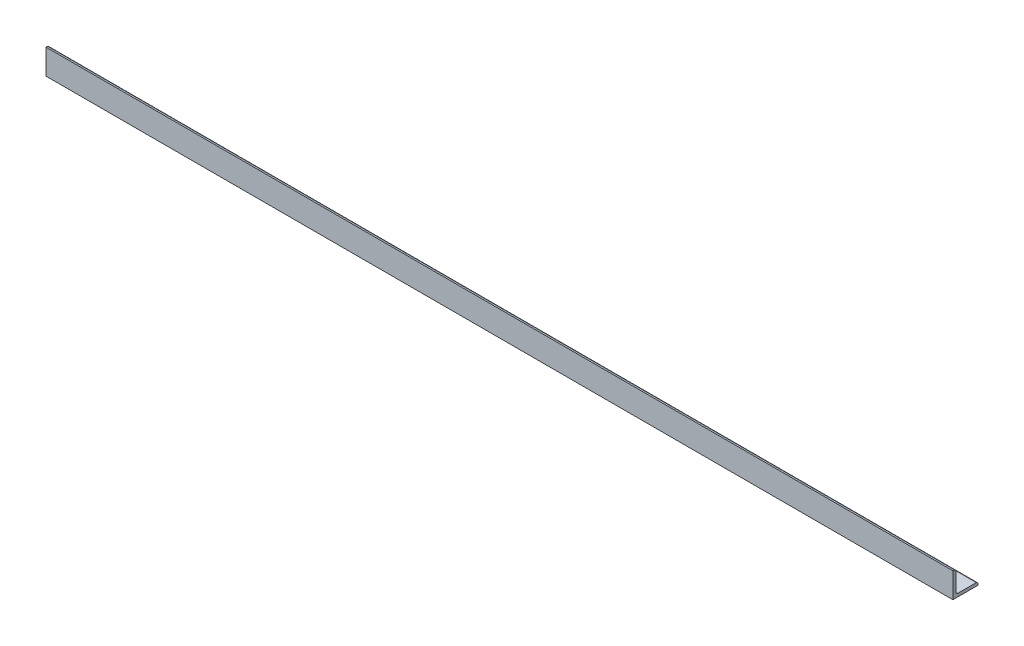
ISO-10303-21;
HEADER;
FILE_DESCRIPTION(('STEP AP214'),'2;1');
FILE_NAME('part.step','',(''),(''),'','','');
FILE_SCHEMA(('AUTOMOTIVE_DESIGN { 1 0 10303 214 1 1 1 1 }'));
ENDSEC;
DATA;
#1=APPLICATION_CONTEXT('core data for automotive mechanical design processes');
#2=APPLICATION_PROTOCOL_DEFINITION('international standard','automotive_design',2000,#1);
#3=PRODUCT_CONTEXT('',#1,'mechanical');
#4=PRODUCT('Part','Part','',(#3));
#5=PRODUCT_RELATED_PRODUCT_CATEGORY('part','',(#4));
#6=PRODUCT_DEFINITION_FORMATION('','',#4);
#7=PRODUCT_DEFINITION_CONTEXT('part definition',#1,'design');
#8=PRODUCT_DEFINITION('design','',#6,#7);
#9=PRODUCT_DEFINITION_SHAPE('','',#8);
#10=(LENGTH_UNIT() NAMED_UNIT(*) SI_UNIT(.MILLI.,.METRE.));
#11=(NAMED_UNIT(*) PLANE_ANGLE_UNIT() SI_UNIT($,.RADIAN.));
#12=(NAMED_UNIT(*) SI_UNIT($,.STERADIAN.) SOLID_ANGLE_UNIT());
#13=UNCERTAINTY_MEASURE_WITH_UNIT(LENGTH_MEASURE(1.E-05),#10,'distance_accuracy_value','');
#14=(GEOMETRIC_REPRESENTATION_CONTEXT(3) GLOBAL_UNCERTAINTY_ASSIGNED_CONTEXT((#13)) GLOBAL_UNIT_ASSIGNED_CONTEXT((#10,
#11,#12)) REPRESENTATION_CONTEXT('',''));
#15=CARTESIAN_POINT('',(0.,0.,0.));
#16=DIRECTION('',(0.,0.,1.));
#17=DIRECTION('',(1.,0.,0.));
#18=AXIS2_PLACEMENT_3D('',#15,#16,#17);
#19=CARTESIAN_POINT('',(150.460652388512,-310.689072168843,-670.15));
#20=DIRECTION('',(0.,-1.,0.));
#21=DIRECTION('',(0.,0.,-1.));
#22=AXIS2_PLACEMENT_3D('',#19,#20,#21);
#23=CYLINDRICAL_SURFACE('',#22,3.4);
#24=CARTESIAN_POINT('',(150.460652388512,-305.926572168843,-670.15));
#25=DIRECTION('',(0.,-1.,0.));
#26=DIRECTION('',(0.,0.,-1.));
#27=AXIS2_PLACEMENT_3D('',#24,#25,#26);
#28=CIRCLE('',#27,3.4);
#29=CARTESIAN_POINT('',(150.460652388512,-305.926572168843,-673.55));
#30=VERTEX_POINT('',#29);
#31=EDGE_CURVE('E19',#30,#30,#28,.F.);
#32=ORIENTED_EDGE('',*,*,#31,.T.);
#33=EDGE_LOOP('',(#32));
#34=FACE_BOUND('',#33,.T.);
#35=CARTESIAN_POINT('',(150.460652388512,-310.017902480979,-670.15));
#36=DIRECTION('',(0.,-1.,0.));
#37=DIRECTION('',(-1.,0.,0.));
#38=AXIS2_PLACEMENT_3D('',#35,#36,#37);
#39=CIRCLE('',#38,3.39999999999394);
#40=CARTESIAN_POINT('',(147.060652388518,-310.017902480979,-670.15));
#41=VERTEX_POINT('',#40);
#42=EDGE_CURVE('E102',#41,#41,#39,.T.);
#43=ORIENTED_EDGE('',*,*,#42,.T.);
#44=EDGE_LOOP('',(#43));
#45=FACE_BOUND('',#44,.T.);
#46=ADVANCED_FACE('F16',(#34,#45),#23,.F.);
#47=CARTESIAN_POINT('',(-150.489347611488,-310.689072168843,-670.15));
#48=DIRECTION('',(0.,-1.,0.));
#49=DIRECTION('',(0.,0.,-1.));
#50=AXIS2_PLACEMENT_3D('',#47,#48,#49);
#51=CYLINDRICAL_SURFACE('',#50,3.4);
#52=CARTESIAN_POINT('',(-150.489347611488,-305.926572168843,-670.15));
#53=DIRECTION('',(0.,-1.,0.));
#54=DIRECTION('',(0.,0.,-1.));
#55=AXIS2_PLACEMENT_3D('',#52,#53,#54);
#56=CIRCLE('',#55,3.4);
#57=CARTESIAN_POINT('',(-150.489347611488,-305.926572168843,-673.55));
#58=VERTEX_POINT('',#57);
#59=EDGE_CURVE('E163',#58,#58,#56,.F.);
#60=ORIENTED_EDGE('',*,*,#59,.T.);
#61=EDGE_LOOP('',(#60));
#62=FACE_BOUND('',#61,.T.);
#63=CARTESIAN_POINT('',(-150.489347611488,-310.017902480922,-670.15));
#64=DIRECTION('',(0.,-1.,0.));
#65=DIRECTION('',(-1.,0.,0.));
#66=AXIS2_PLACEMENT_3D('',#63,#64,#65);
#67=CIRCLE('',#66,3.39999999999421);
#68=CARTESIAN_POINT('',(-153.889347611482,-310.017902480922,-670.15));
#69=VERTEX_POINT('',#68);
#70=EDGE_CURVE('E196',#69,#69,#67,.T.);
#71=ORIENTED_EDGE('',*,*,#70,.T.);
#72=EDGE_LOOP('',(#71));
#73=FACE_BOUND('',#72,.T.);
#74=ADVANCED_FACE('F404',(#62,#73),#51,.F.);
#75=CARTESIAN_POINT('',(-150.489347611488,-310.689072168827,-670.15));
#76=DIRECTION('',(0.,-1.,0.));
#77=DIRECTION('',(0.,0.,-1.));
#78=AXIS2_PLACEMENT_3D('',#75,#76,#77);
#79=CONICAL_SURFACE('',#78,4.5624999999582,1.04719755120111);
#80=CARTESIAN_POINT('',(-150.489347611488,-310.689072168827,-670.15));
#81=DIRECTION('',(0.,-1.,0.));
#82=DIRECTION('',(0.,0.,-1.));
#83=AXIS2_PLACEMENT_3D('',#80,#81,#82);
#84=CIRCLE('',#83,4.56249999995817);
#85=CARTESIAN_POINT('',(-150.489347611488,-310.689072168827,-674.712499999958));
#86=VERTEX_POINT('',#85);
#87=EDGE_CURVE('E217',#86,#86,#84,.T.);
#88=ORIENTED_EDGE('',*,*,#87,.T.);
#89=EDGE_LOOP('',(#88));
#90=FACE_BOUND('',#89,.T.);
#91=ORIENTED_EDGE('',*,*,#70,.F.);
#92=EDGE_LOOP('',(#91));
#93=FACE_BOUND('',#92,.T.);
#94=ADVANCED_FACE('F394',(#90,#93),#79,.F.);
#95=CARTESIAN_POINT('',(-823.489347611489,-268.779069768843,-675.15));
#96=DIRECTION('',(0.,-1.,0.));
#97=DIRECTION('',(0.,0.,-1.));
#98=AXIS2_PLACEMENT_3D('',#95,#96,#97);
#99=CYLINDRICAL_SURFACE('',#98,4.5);
#100=CARTESIAN_POINT('',(-823.489347611489,-310.689072168843,-675.15));
#101=DIRECTION('',(0.,-1.,0.));
#102=DIRECTION('',(0.,0.,-1.));
#103=AXIS2_PLACEMENT_3D('',#100,#101,#102);
#104=CIRCLE('',#103,4.5);
#105=CARTESIAN_POINT('',(-823.489347611489,-310.689072168843,-679.65));
#106=VERTEX_POINT('',#105);
#107=EDGE_CURVE('E213',#106,#106,#104,.T.);
#108=ORIENTED_EDGE('',*,*,#107,.T.);
#109=EDGE_LOOP('',(#108));
#110=FACE_BOUND('',#109,.T.);
#111=CARTESIAN_POINT('',(-823.489347611489,-305.926572168843,-675.15));
#112=DIRECTION('',(0.,-1.,0.));
#113=DIRECTION('',(0.,0.,-1.));
#114=AXIS2_PLACEMENT_3D('',#111,#112,#113);
#115=CIRCLE('',#114,4.5);
#116=CARTESIAN_POINT('',(-823.489347611489,-305.926572168843,-679.65));
#117=VERTEX_POINT('',#116);
#118=EDGE_CURVE('E226',#117,#117,#115,.F.);
#119=ORIENTED_EDGE('',*,*,#118,.T.);
#120=EDGE_LOOP('',(#119));
#121=FACE_BOUND('',#120,.T.);
#122=ADVANCED_FACE('F384',(#110,#121),#99,.F.);
#123=CARTESIAN_POINT('',(150.460652388512,-310.689072168884,-670.15));
#124=DIRECTION('',(0.,-1.,0.));
#125=DIRECTION('',(0.,0.,-1.));
#126=AXIS2_PLACEMENT_3D('',#123,#124,#125);
#127=CONICAL_SURFACE('',#126,4.56249999995792,1.04719755120111);
#128=CARTESIAN_POINT('',(150.460652388512,-310.689072168884,-670.15));
#129=DIRECTION('',(0.,-1.,0.));
#130=DIRECTION('',(0.,0.,-1.));
#131=AXIS2_PLACEMENT_3D('',#128,#129,#130);
#132=CIRCLE('',#131,4.56249999995795);
#133=CARTESIAN_POINT('',(150.460652388512,-310.689072168884,-674.712499999958));
#134=VERTEX_POINT('',#133);
#135=EDGE_CURVE('E185',#134,#134,#132,.T.);
#136=ORIENTED_EDGE('',*,*,#135,.T.);
#137=EDGE_LOOP('',(#136));
#138=FACE_BOUND('',#137,.T.);
#139=ORIENTED_EDGE('',*,*,#42,.F.);
#140=EDGE_LOOP('',(#139));
#141=FACE_BOUND('',#140,.T.);
#142=ADVANCED_FACE('F375',(#138,#141),#127,.F.);
#143=CARTESIAN_POINT('',(551.510652388512,-305.926572168843,-690.15));
#144=DIRECTION('',(0.,0.,1.));
#145=DIRECTION('',(1.,0.,0.));
#146=AXIS2_PLACEMENT_3D('',#143,#144,#145);
#147=PLANE('',#146);
#148=DIRECTION('',(0.,1.,0.));
#149=VECTOR('',#148,1.);
#150=CARTESIAN_POINT('',(-861.589347611489,-310.689072168843,-690.15));
#151=LINE('',#150,#149);
#152=CARTESIAN_POINT('',(-861.589347611489,-308.926572168843,-690.15));
#153=VERTEX_POINT('',#152);
#154=CARTESIAN_POINT('',(-861.589347611489,-310.689072168843,-690.15));
#155=VERTEX_POINT('',#154);
#156=EDGE_CURVE('E172',#153,#155,#151,.F.);
#157=ORIENTED_EDGE('',*,*,#156,.F.);
#158=DIRECTION('',(-1.,0.,0.));
#159=VECTOR('',#158,1.);
#160=CARTESIAN_POINT('',(0.,-308.926572168843,-690.15));
#161=LINE('',#160,#159);
#162=CARTESIAN_POINT('',(514.610652388512,-308.926572168843,-690.15));
#163=VERTEX_POINT('',#162);
#164=EDGE_CURVE('E158',#163,#153,#161,.T.);
#165=ORIENTED_EDGE('',*,*,#164,.F.);
#166=DIRECTION('',(0.,1.,0.));
#167=VECTOR('',#166,1.);
#168=CARTESIAN_POINT('',(514.610652388512,-313.864072168843,-690.15));
#169=LINE('',#168,#167);
#170=CARTESIAN_POINT('',(514.610652388512,-310.689072168843,-690.15));
#171=VERTEX_POINT('',#170);
#172=EDGE_CURVE('E121',#171,#163,#169,.T.);
#173=ORIENTED_EDGE('',*,*,#172,.F.);
#174=DIRECTION('',(1.,0.,0.));
#175=VECTOR('',#174,1.);
#176=CARTESIAN_POINT('',(551.510652388512,-310.689072168843,-690.15));
#177=LINE('',#176,#175);
#178=EDGE_CURVE('E168',#171,#155,#177,.F.);
#179=ORIENTED_EDGE('',*,*,#178,.T.);
#180=EDGE_LOOP('',(#157,#165,#173,#179));
#181=FACE_BOUND('',#180,.T.);
#182=ADVANCED_FACE('F252',(#181),#147,.F.);
#183=CARTESIAN_POINT('',(551.510652388512,-272.589072168843,-656.8125));
#184=DIRECTION('',(0.,0.,1.));
#185=DIRECTION('',(1.,0.,0.));
#186=AXIS2_PLACEMENT_3D('',#183,#184,#185);
#187=PLANE('',#186);
#188=DIRECTION('',(0.,1.,0.));
#189=VECTOR('',#188,1.);
#190=CARTESIAN_POINT('',(514.610652388512,-313.864072168843,-656.8125));
#191=LINE('',#190,#189);
#192=CARTESIAN_POINT('',(514.610652388512,-302.926572168843,-656.8125));
#193=VERTEX_POINT('',#192);
#194=CARTESIAN_POINT('',(514.610652388512,-275.589072168843,-656.8125));
#195=VERTEX_POINT('',#194);
#196=EDGE_CURVE('E106',#193,#195,#191,.T.);
#197=ORIENTED_EDGE('',*,*,#196,.F.);
#198=DIRECTION('',(-1.,0.,0.));
#199=VECTOR('',#198,1.);
#200=CARTESIAN_POINT('',(0.,-302.926572168843,-656.8125));
#201=LINE('',#200,#199);
#202=CARTESIAN_POINT('',(-861.589347611489,-302.926572168843,-656.8125));
#203=VERTEX_POINT('',#202);
#204=EDGE_CURVE('E93',#193,#203,#201,.T.);
#205=ORIENTED_EDGE('',*,*,#204,.T.);
#206=DIRECTION('',(0.,1.,0.));
#207=VECTOR('',#206,1.);
#208=CARTESIAN_POINT('',(-861.589347611489,-310.689072168843,-656.8125));
#209=LINE('',#208,#207);
#210=CARTESIAN_POINT('',(-861.589347611489,-275.589072168843,-656.8125));
#211=VERTEX_POINT('',#210);
#212=EDGE_CURVE('E206',#211,#203,#209,.F.);
#213=ORIENTED_EDGE('',*,*,#212,.F.);
#214=DIRECTION('',(1.,0.,0.));
#215=VECTOR('',#214,1.);
#216=CARTESIAN_POINT('',(0.,-275.589072168843,-656.8125));
#217=LINE('',#216,#215);
#218=EDGE_CURVE('E113',#195,#211,#217,.F.);
#219=ORIENTED_EDGE('',*,*,#218,.F.);
#220=EDGE_LOOP('',(#197,#205,#213,#219));
#221=FACE_BOUND('',#220,.T.);
#222=ADVANCED_FACE('F112',(#221),#187,.F.);
#223=CARTESIAN_POINT('',(0.,-302.926572168843,-659.8125));
#224=DIRECTION('',(-1.,0.,0.));
#225=DIRECTION('',(0.,0.,1.));
#226=AXIS2_PLACEMENT_3D('',#223,#224,#225);
#227=CYLINDRICAL_SURFACE('',#226,3.);
#228=CARTESIAN_POINT('',(-861.589347611489,-302.926572168843,-659.8125));
#229=DIRECTION('',(-1.,0.,0.));
#230=DIRECTION('',(0.,0.,1.));
#231=AXIS2_PLACEMENT_3D('',#228,#229,#230);
#232=CIRCLE('',#231,3.);
#233=CARTESIAN_POINT('',(-861.589347611489,-305.926572168843,-659.8125));
#234=VERTEX_POINT('',#233);
#235=EDGE_CURVE('E97',#203,#234,#232,.F.);
#236=ORIENTED_EDGE('',*,*,#235,.F.);
#237=ORIENTED_EDGE('',*,*,#204,.F.);
#238=CARTESIAN_POINT('',(514.610652388512,-302.926572168843,-659.8125));
#239=DIRECTION('',(-1.,0.,0.));
#240=DIRECTION('',(0.,0.,1.));
#241=AXIS2_PLACEMENT_3D('',#238,#239,#240);
#242=CIRCLE('',#241,3.);
#243=CARTESIAN_POINT('',(514.610652388512,-305.926572168843,-659.8125));
#244=VERTEX_POINT('',#243);
#245=EDGE_CURVE('E96',#244,#193,#242,.T.);
#246=ORIENTED_EDGE('',*,*,#245,.F.);
#247=DIRECTION('',(1.,0.,0.));
#248=VECTOR('',#247,1.);
#249=CARTESIAN_POINT('',(551.510652388512,-305.926572168843,-659.8125));
#250=LINE('',#249,#248);
#251=EDGE_CURVE('E86',#244,#234,#250,.F.);
#252=ORIENTED_EDGE('',*,*,#251,.T.);
#253=EDGE_LOOP('',(#236,#237,#246,#252));
#254=FACE_BOUND('',#253,.T.);
#255=ADVANCED_FACE('F95',(#254),#227,.F.);
#256=CARTESIAN_POINT('',(551.510652388512,-305.926572168843,-656.8125));
#257=DIRECTION('',(0.,-1.,0.));
#258=DIRECTION('',(0.,0.,-1.));
#259=AXIS2_PLACEMENT_3D('',#256,#257,#258);
#260=PLANE('',#259);
#261=ORIENTED_EDGE('',*,*,#59,.F.);
#262=EDGE_LOOP('',(#261));
#263=FACE_BOUND('',#262,.T.);
#264=ORIENTED_EDGE('',*,*,#118,.F.);
#265=EDGE_LOOP('',(#264));
#266=FACE_BOUND('',#265,.T.);
#267=ORIENTED_EDGE('',*,*,#31,.F.);
#268=EDGE_LOOP('',(#267));
#269=FACE_BOUND('',#268,.T.);
#270=DIRECTION('',(0.,0.,-1.));
#271=VECTOR('',#270,1.);
#272=CARTESIAN_POINT('',(514.610652388512,-305.926572168843,-133.95));
#273=LINE('',#272,#271);
#274=CARTESIAN_POINT('',(514.610652388512,-305.926572168843,-687.15));
#275=VERTEX_POINT('',#274);
#276=EDGE_CURVE('E109',#275,#244,#273,.F.);
#277=ORIENTED_EDGE('',*,*,#276,.F.);
#278=DIRECTION('',(-1.,0.,0.));
#279=VECTOR('',#278,1.);
#280=CARTESIAN_POINT('',(0.,-305.926572168843,-687.15));
#281=LINE('',#280,#279);
#282=CARTESIAN_POINT('',(-861.589347611489,-305.926572168843,-687.15));
#283=VERTEX_POINT('',#282);
#284=EDGE_CURVE('E160',#283,#275,#281,.F.);
#285=ORIENTED_EDGE('',*,*,#284,.F.);
#286=DIRECTION('',(0.,0.,1.));
#287=VECTOR('',#286,1.);
#288=CARTESIAN_POINT('',(-861.589347611489,-305.926572168843,-793.95));
#289=LINE('',#288,#287);
#290=EDGE_CURVE('E203',#234,#283,#289,.F.);
#291=ORIENTED_EDGE('',*,*,#290,.F.);
#292=ORIENTED_EDGE('',*,*,#251,.F.);
#293=EDGE_LOOP('',(#277,#285,#291,#292));
#294=FACE_BOUND('',#293,.T.);
#295=ADVANCED_FACE('F238',(#263,#266,#269,#294),#260,.F.);
#296=CARTESIAN_POINT('',(0.,-308.926572168843,-687.15));
#297=DIRECTION('',(-1.,0.,0.));
#298=DIRECTION('',(0.,0.,1.));
#299=AXIS2_PLACEMENT_3D('',#296,#297,#298);
#300=CYLINDRICAL_SURFACE('',#299,3.);
#301=ORIENTED_EDGE('',*,*,#164,.T.);
#302=CARTESIAN_POINT('',(-861.589347611489,-308.926572168843,-687.15));
#303=DIRECTION('',(-1.,0.,0.));
#304=DIRECTION('',(0.,0.,1.));
#305=AXIS2_PLACEMENT_3D('',#302,#303,#304);
#306=CIRCLE('',#305,3.);
#307=EDGE_CURVE('E150',#283,#153,#306,.T.);
#308=ORIENTED_EDGE('',*,*,#307,.F.);
#309=ORIENTED_EDGE('',*,*,#284,.T.);
#310=CARTESIAN_POINT('',(514.610652388512,-308.926572168843,-687.15));
#311=DIRECTION('',(-1.,0.,0.));
#312=DIRECTION('',(0.,0.,1.));
#313=AXIS2_PLACEMENT_3D('',#310,#311,#312);
#314=CIRCLE('',#313,3.);
#315=EDGE_CURVE('E221',#163,#275,#314,.F.);
#316=ORIENTED_EDGE('',*,*,#315,.F.);
#317=EDGE_LOOP('',(#301,#308,#309,#316));
#318=FACE_BOUND('',#317,.T.);
#319=ADVANCED_FACE('F240',(#318),#300,.T.);
#320=CARTESIAN_POINT('',(0.,-275.589072168843,-653.8125));
#321=DIRECTION('',(1.,0.,0.));
#322=DIRECTION('',(0.,0.,-1.));
#323=AXIS2_PLACEMENT_3D('',#320,#321,#322);
#324=CYLINDRICAL_SURFACE('',#323,3.);
#325=DIRECTION('',(1.,0.,0.));
#326=VECTOR('',#325,1.);
#327=CARTESIAN_POINT('',(551.510652388512,-272.589072168843,-653.8125));
#328=LINE('',#327,#326);
#329=CARTESIAN_POINT('',(-861.589347611489,-272.589072168843,-653.8125));
#330=VERTEX_POINT('',#329);
#331=CARTESIAN_POINT('',(514.610652388512,-272.589072168843,-653.8125));
#332=VERTEX_POINT('',#331);
#333=EDGE_CURVE('E129',#330,#332,#328,.T.);
#334=ORIENTED_EDGE('',*,*,#333,.T.);
#335=CARTESIAN_POINT('',(514.610652388512,-275.589072168843,-653.8125));
#336=DIRECTION('',(1.,0.,0.));
#337=DIRECTION('',(0.,0.,-1.));
#338=AXIS2_PLACEMENT_3D('',#335,#336,#337);
#339=CIRCLE('',#338,3.);
#340=EDGE_CURVE('E116',#195,#332,#339,.T.);
#341=ORIENTED_EDGE('',*,*,#340,.F.);
#342=ORIENTED_EDGE('',*,*,#218,.T.);
#343=CARTESIAN_POINT('',(-861.589347611489,-275.589072168843,-653.8125));
#344=DIRECTION('',(1.,0.,0.));
#345=DIRECTION('',(0.,0.,-1.));
#346=AXIS2_PLACEMENT_3D('',#343,#344,#345);
#347=CIRCLE('',#346,3.);
#348=EDGE_CURVE('E179',#330,#211,#347,.F.);
#349=ORIENTED_EDGE('',*,*,#348,.F.);
#350=EDGE_LOOP('',(#334,#341,#342,#349));
#351=FACE_BOUND('',#350,.T.);
#352=ADVANCED_FACE('F272',(#351),#324,.T.);
#353=CARTESIAN_POINT('',(514.610652388512,-313.864072168843,-133.95));
#354=DIRECTION('',(1.,0.,0.));
#355=DIRECTION('',(0.,0.,-1.));
#356=AXIS2_PLACEMENT_3D('',#353,#354,#355);
#357=PLANE('',#356);
#358=ORIENTED_EDGE('',*,*,#172,.T.);
#359=ORIENTED_EDGE('',*,*,#315,.T.);
#360=ORIENTED_EDGE('',*,*,#276,.T.);
#361=ORIENTED_EDGE('',*,*,#245,.T.);
#362=ORIENTED_EDGE('',*,*,#196,.T.);
#363=ORIENTED_EDGE('',*,*,#340,.T.);
#364=DIRECTION('',(0.,0.,-1.));
#365=VECTOR('',#364,1.);
#366=CARTESIAN_POINT('',(514.610652388512,-272.589072168843,-652.05));
#367=LINE('',#366,#365);
#368=CARTESIAN_POINT('',(514.610652388512,-272.589072168843,-652.05));
#369=VERTEX_POINT('',#368);
#370=EDGE_CURVE('E136',#332,#369,#367,.F.);
#371=ORIENTED_EDGE('',*,*,#370,.T.);
#372=DIRECTION('',(0.,1.,0.));
#373=VECTOR('',#372,1.);
#374=CARTESIAN_POINT('',(514.610652388512,-310.689072168843,-652.05));
#375=LINE('',#374,#373);
#376=CARTESIAN_POINT('',(514.610652388512,-310.689072168843,-652.05));
#377=VERTEX_POINT('',#376);
#378=EDGE_CURVE('E133',#369,#377,#375,.F.);
#379=ORIENTED_EDGE('',*,*,#378,.T.);
#380=DIRECTION('',(0.,0.,1.));
#381=VECTOR('',#380,1.);
#382=CARTESIAN_POINT('',(514.610652388512,-310.689072168843,-690.15));
#383=LINE('',#382,#381);
#384=EDGE_CURVE('E173',#377,#171,#383,.F.);
#385=ORIENTED_EDGE('',*,*,#384,.T.);
#386=EDGE_LOOP('',(#358,#359,#360,#361,#362,#363,#371,#379,#385));
#387=FACE_BOUND('',#386,.T.);
#388=ADVANCED_FACE('F105',(#387),#357,.T.);
#389=CARTESIAN_POINT('',(551.510652388512,-310.689072168843,-690.15));
#390=DIRECTION('',(0.,1.,0.));
#391=DIRECTION('',(0.,0.,1.));
#392=AXIS2_PLACEMENT_3D('',#389,#390,#391);
#393=PLANE('',#392);
#394=DIRECTION('',(0.,0.,1.));
#395=VECTOR('',#394,1.);
#396=CARTESIAN_POINT('',(-861.589347611489,-310.689072168843,-793.95));
#397=LINE('',#396,#395);
#398=CARTESIAN_POINT('',(-861.589347611489,-310.689072168843,-652.05));
#399=VERTEX_POINT('',#398);
#400=EDGE_CURVE('E176',#155,#399,#397,.T.);
#401=ORIENTED_EDGE('',*,*,#400,.F.);
#402=ORIENTED_EDGE('',*,*,#178,.F.);
#403=ORIENTED_EDGE('',*,*,#384,.F.);
#404=DIRECTION('',(-1.,0.,0.));
#405=VECTOR('',#404,1.);
#406=CARTESIAN_POINT('',(551.510652388512,-310.689072168843,-652.05));
#407=LINE('',#406,#405);
#408=EDGE_CURVE('E144',#377,#399,#407,.T.);
#409=ORIENTED_EDGE('',*,*,#408,.T.);
#410=EDGE_LOOP('',(#401,#402,#403,#409));
#411=FACE_BOUND('',#410,.T.);
#412=ORIENTED_EDGE('',*,*,#135,.F.);
#413=EDGE_LOOP('',(#412));
#414=FACE_BOUND('',#413,.T.);
#415=ORIENTED_EDGE('',*,*,#107,.F.);
#416=EDGE_LOOP('',(#415));
#417=FACE_BOUND('',#416,.T.);
#418=ORIENTED_EDGE('',*,*,#87,.F.);
#419=EDGE_LOOP('',(#418));
#420=FACE_BOUND('',#419,.T.);
#421=ADVANCED_FACE('F263',(#411,#414,#417,#420),#393,.F.);
#422=CARTESIAN_POINT('',(-861.589347611489,-310.689072168843,-793.95));
#423=DIRECTION('',(-1.,0.,0.));
#424=DIRECTION('',(0.,0.,1.));
#425=AXIS2_PLACEMENT_3D('',#422,#423,#424);
#426=PLANE('',#425);
#427=ORIENTED_EDGE('',*,*,#290,.T.);
#428=ORIENTED_EDGE('',*,*,#307,.T.);
#429=ORIENTED_EDGE('',*,*,#156,.T.);
#430=ORIENTED_EDGE('',*,*,#400,.T.);
#431=DIRECTION('',(0.,1.,0.));
#432=VECTOR('',#431,1.);
#433=CARTESIAN_POINT('',(-861.589347611489,-310.689072168843,-652.05));
#434=LINE('',#433,#432);
#435=CARTESIAN_POINT('',(-861.589347611489,-272.589072168843,-652.05));
#436=VERTEX_POINT('',#435);
#437=EDGE_CURVE('E26',#399,#436,#434,.T.);
#438=ORIENTED_EDGE('',*,*,#437,.T.);
#439=DIRECTION('',(0.,0.,-1.));
#440=VECTOR('',#439,1.);
#441=CARTESIAN_POINT('',(-861.589347611489,-272.589072168843,-652.05));
#442=LINE('',#441,#440);
#443=EDGE_CURVE('E34',#436,#330,#442,.T.);
#444=ORIENTED_EDGE('',*,*,#443,.T.);
#445=ORIENTED_EDGE('',*,*,#348,.T.);
#446=ORIENTED_EDGE('',*,*,#212,.T.);
#447=ORIENTED_EDGE('',*,*,#235,.T.);
#448=EDGE_LOOP('',(#427,#428,#429,#430,#438,#444,#445,#446,#447));
#449=FACE_BOUND('',#448,.T.);
#450=ADVANCED_FACE('F250',(#449),#426,.T.);
#451=CARTESIAN_POINT('',(551.510652388512,-272.589072168843,-652.05));
#452=DIRECTION('',(0.,-1.,0.));
#453=DIRECTION('',(0.,0.,-1.));
#454=AXIS2_PLACEMENT_3D('',#451,#452,#453);
#455=PLANE('',#454);
#456=ORIENTED_EDGE('',*,*,#443,.F.);
#457=DIRECTION('',(-1.,0.,0.));
#458=VECTOR('',#457,1.);
#459=CARTESIAN_POINT('',(551.510652388512,-272.589072168843,-652.05));
#460=LINE('',#459,#458);
#461=EDGE_CURVE('E11',#436,#369,#460,.F.);
#462=ORIENTED_EDGE('',*,*,#461,.T.);
#463=ORIENTED_EDGE('',*,*,#370,.F.);
#464=ORIENTED_EDGE('',*,*,#333,.F.);
#465=EDGE_LOOP('',(#456,#462,#463,#464));
#466=FACE_BOUND('',#465,.T.);
#467=ADVANCED_FACE('F270',(#466),#455,.F.);
#468=CARTESIAN_POINT('',(551.510652388512,-310.689072168843,-652.05));
#469=DIRECTION('',(0.,0.,-1.));
#470=DIRECTION('',(-1.,0.,0.));
#471=AXIS2_PLACEMENT_3D('',#468,#469,#470);
#472=PLANE('',#471);
#473=ORIENTED_EDGE('',*,*,#437,.F.);
#474=ORIENTED_EDGE('',*,*,#408,.F.);
#475=ORIENTED_EDGE('',*,*,#378,.F.);
#476=ORIENTED_EDGE('',*,*,#461,.F.);
#477=EDGE_LOOP('',(#473,#474,#475,#476));
#478=FACE_BOUND('',#477,.T.);
#479=ADVANCED_FACE('F268',(#478),#472,.F.);
#480=CLOSED_SHELL('',(#46,#74,#94,#122,#142,#182,#222,#255,#295,#319,#352,#388,#421,#450,#467,#479));
#481=MANIFOLD_SOLID_BREP('B1',#480);
#482=ADVANCED_BREP_SHAPE_REPRESENTATION('',(#18,#481),#14);
#483=SHAPE_DEFINITION_REPRESENTATION(#9,#482);
ENDSEC;
END-ISO-10303-21;
